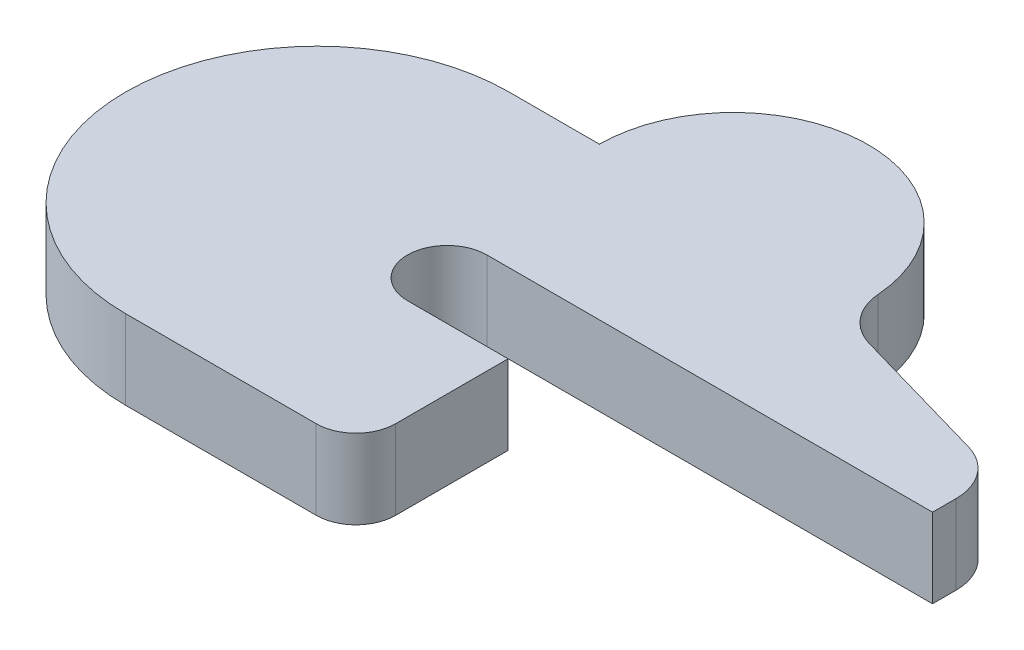
ISO-10303-21;
HEADER;
FILE_DESCRIPTION(('STEP AP214'),'2;1');
FILE_NAME('part.step','',(''),(''),'','','');
FILE_SCHEMA(('AUTOMOTIVE_DESIGN { 1 0 10303 214 1 1 1 1 }'));
ENDSEC;
DATA;
#1=APPLICATION_CONTEXT('core data for automotive mechanical design processes');
#2=APPLICATION_PROTOCOL_DEFINITION('international standard','automotive_design',2000,#1);
#3=PRODUCT_CONTEXT('',#1,'mechanical');
#4=PRODUCT('Part','Part','',(#3));
#5=PRODUCT_RELATED_PRODUCT_CATEGORY('part','',(#4));
#6=PRODUCT_DEFINITION_FORMATION('','',#4);
#7=PRODUCT_DEFINITION_CONTEXT('part definition',#1,'design');
#8=PRODUCT_DEFINITION('design','',#6,#7);
#9=PRODUCT_DEFINITION_SHAPE('','',#8);
#10=(LENGTH_UNIT() NAMED_UNIT(*) SI_UNIT(.MILLI.,.METRE.));
#11=(NAMED_UNIT(*) PLANE_ANGLE_UNIT() SI_UNIT($,.RADIAN.));
#12=(NAMED_UNIT(*) SI_UNIT($,.STERADIAN.) SOLID_ANGLE_UNIT());
#13=UNCERTAINTY_MEASURE_WITH_UNIT(LENGTH_MEASURE(1.E-05),#10,'distance_accuracy_value','');
#14=(GEOMETRIC_REPRESENTATION_CONTEXT(3) GLOBAL_UNCERTAINTY_ASSIGNED_CONTEXT((#13)) GLOBAL_UNIT_ASSIGNED_CONTEXT((#10,
#11,#12)) REPRESENTATION_CONTEXT('',''));
#15=CARTESIAN_POINT('',(0.,0.,0.));
#16=DIRECTION('',(0.,0.,1.));
#17=DIRECTION('',(1.,0.,0.));
#18=AXIS2_PLACEMENT_3D('',#15,#16,#17);
#19=CARTESIAN_POINT('',(0.,3.,4.25));
#20=DIRECTION('',(-1.,0.,0.));
#21=DIRECTION('',(0.,0.,1.));
#22=AXIS2_PLACEMENT_3D('',#19,#20,#21);
#23=PLANE('',#22);
#24=DIRECTION('',(0.,0.,-1.));
#25=VECTOR('',#24,1.);
#26=CARTESIAN_POINT('',(0.,0.,4.25));
#27=LINE('',#26,#25);
#28=CARTESIAN_POINT('',(0.,0.,4.25));
#29=VERTEX_POINT('',#28);
#30=CARTESIAN_POINT('',(0.,0.,0.));
#31=VERTEX_POINT('',#30);
#32=EDGE_CURVE('E165',#29,#31,#27,.T.);
#33=ORIENTED_EDGE('',*,*,#32,.T.);
#34=DIRECTION('',(0.,-1.,0.));
#35=VECTOR('',#34,1.);
#36=CARTESIAN_POINT('',(0.,3.,0.));
#37=LINE('',#36,#35);
#38=CARTESIAN_POINT('',(0.,3.,0.));
#39=VERTEX_POINT('',#38);
#40=EDGE_CURVE('E11',#39,#31,#37,.T.);
#41=ORIENTED_EDGE('',*,*,#40,.F.);
#42=DIRECTION('',(0.,0.,-1.));
#43=VECTOR('',#42,1.);
#44=CARTESIAN_POINT('',(0.,3.,4.25));
#45=LINE('',#44,#43);
#46=CARTESIAN_POINT('',(0.,3.,4.25));
#47=VERTEX_POINT('',#46);
#48=EDGE_CURVE('E191',#47,#39,#45,.T.);
#49=ORIENTED_EDGE('',*,*,#48,.F.);
#50=DIRECTION('',(0.,-1.,0.));
#51=VECTOR('',#50,1.);
#52=CARTESIAN_POINT('',(0.,3.,4.25));
#53=LINE('',#52,#51);
#54=EDGE_CURVE('E161',#47,#29,#53,.T.);
#55=ORIENTED_EDGE('',*,*,#54,.T.);
#56=EDGE_LOOP('',(#33,#41,#49,#55));
#57=FACE_BOUND('',#56,.T.);
#58=ADVANCED_FACE('F33',(#57),#23,.F.);
#59=CARTESIAN_POINT('',(0.,3.,0.));
#60=DIRECTION('',(0.,0.,1.));
#61=DIRECTION('',(1.,0.,0.));
#62=AXIS2_PLACEMENT_3D('',#59,#60,#61);
#63=PLANE('',#62);
#64=DIRECTION('',(-1.,0.,0.));
#65=VECTOR('',#64,1.);
#66=CARTESIAN_POINT('',(0.,0.,0.));
#67=LINE('',#66,#65);
#68=CARTESIAN_POINT('',(-3.8,0.,0.));
#69=VERTEX_POINT('',#68);
#70=EDGE_CURVE('E168',#31,#69,#67,.T.);
#71=ORIENTED_EDGE('',*,*,#70,.T.);
#72=DIRECTION('',(0.,-1.,0.));
#73=VECTOR('',#72,1.);
#74=CARTESIAN_POINT('',(-3.8,3.,0.));
#75=LINE('',#74,#73);
#76=CARTESIAN_POINT('',(-3.8,3.,0.));
#77=VERTEX_POINT('',#76);
#78=EDGE_CURVE('E41',#77,#69,#75,.T.);
#79=ORIENTED_EDGE('',*,*,#78,.F.);
#80=DIRECTION('',(-1.,0.,0.));
#81=VECTOR('',#80,1.);
#82=CARTESIAN_POINT('',(0.,3.,0.));
#83=LINE('',#82,#81);
#84=EDGE_CURVE('E110',#39,#77,#83,.T.);
#85=ORIENTED_EDGE('',*,*,#84,.F.);
#86=ORIENTED_EDGE('',*,*,#40,.T.);
#87=EDGE_LOOP('',(#71,#79,#85,#86));
#88=FACE_BOUND('',#87,.T.);
#89=ADVANCED_FACE('F279',(#88),#63,.F.);
#90=CARTESIAN_POINT('',(-3.8,3.,-1.5));
#91=DIRECTION('',(0.,-1.,0.));
#92=DIRECTION('',(0.,0.,-1.));
#93=AXIS2_PLACEMENT_3D('',#90,#91,#92);
#94=CYLINDRICAL_SURFACE('',#93,1.5);
#95=CARTESIAN_POINT('',(-3.8,0.,-1.5));
#96=DIRECTION('',(0.,-1.,0.));
#97=DIRECTION('',(0.,0.,-1.));
#98=AXIS2_PLACEMENT_3D('',#95,#96,#97);
#99=CIRCLE('',#98,1.5);
#100=CARTESIAN_POINT('',(-3.8,0.,-3.));
#101=VERTEX_POINT('',#100);
#102=EDGE_CURVE('E170',#69,#101,#99,.T.);
#103=ORIENTED_EDGE('',*,*,#102,.T.);
#104=DIRECTION('',(0.,-1.,0.));
#105=VECTOR('',#104,1.);
#106=CARTESIAN_POINT('',(-3.8,3.,-3.));
#107=LINE('',#106,#105);
#108=CARTESIAN_POINT('',(-3.8,3.,-3.));
#109=VERTEX_POINT('',#108);
#110=EDGE_CURVE('E216',#109,#101,#107,.T.);
#111=ORIENTED_EDGE('',*,*,#110,.F.);
#112=CARTESIAN_POINT('',(-3.8,3.,-1.5));
#113=DIRECTION('',(0.,-1.,0.));
#114=DIRECTION('',(0.,0.,-1.));
#115=AXIS2_PLACEMENT_3D('',#112,#113,#114);
#116=CIRCLE('',#115,1.5);
#117=EDGE_CURVE('E224',#77,#109,#116,.T.);
#118=ORIENTED_EDGE('',*,*,#117,.F.);
#119=ORIENTED_EDGE('',*,*,#78,.T.);
#120=EDGE_LOOP('',(#103,#111,#118,#119));
#121=FACE_BOUND('',#120,.T.);
#122=ADVANCED_FACE('F222',(#121),#94,.F.);
#123=CARTESIAN_POINT('',(-3.8,3.,-3.));
#124=DIRECTION('',(0.,0.,-1.));
#125=DIRECTION('',(-1.,0.,0.));
#126=AXIS2_PLACEMENT_3D('',#123,#124,#125);
#127=PLANE('',#126);
#128=DIRECTION('',(1.,0.,0.));
#129=VECTOR('',#128,1.);
#130=CARTESIAN_POINT('',(-3.8,0.,-3.));
#131=LINE('',#130,#129);
#132=CARTESIAN_POINT('',(13.04,0.,-3.));
#133=VERTEX_POINT('',#132);
#134=EDGE_CURVE('E172',#101,#133,#131,.T.);
#135=ORIENTED_EDGE('',*,*,#134,.T.);
#136=DIRECTION('',(0.,-1.,0.));
#137=VECTOR('',#136,1.);
#138=CARTESIAN_POINT('',(13.04,3.,-3.));
#139=LINE('',#138,#137);
#140=CARTESIAN_POINT('',(13.04,3.,-3.));
#141=VERTEX_POINT('',#140);
#142=EDGE_CURVE('E213',#141,#133,#139,.T.);
#143=ORIENTED_EDGE('',*,*,#142,.F.);
#144=DIRECTION('',(1.,0.,0.));
#145=VECTOR('',#144,1.);
#146=CARTESIAN_POINT('',(-3.8,3.,-3.));
#147=LINE('',#146,#145);
#148=EDGE_CURVE('E242',#109,#141,#147,.T.);
#149=ORIENTED_EDGE('',*,*,#148,.F.);
#150=ORIENTED_EDGE('',*,*,#110,.T.);
#151=EDGE_LOOP('',(#135,#143,#149,#150));
#152=FACE_BOUND('',#151,.T.);
#153=ADVANCED_FACE('F233',(#152),#127,.F.);
#154=CARTESIAN_POINT('',(13.04,3.,-3.));
#155=DIRECTION('',(-1.,0.,0.));
#156=DIRECTION('',(0.,0.,1.));
#157=AXIS2_PLACEMENT_3D('',#154,#155,#156);
#158=PLANE('',#157);
#159=DIRECTION('',(0.,0.,-1.));
#160=VECTOR('',#159,1.);
#161=CARTESIAN_POINT('',(13.04,0.,-3.));
#162=LINE('',#161,#160);
#163=CARTESIAN_POINT('',(13.04,0.,-3.89269180939431));
#164=VERTEX_POINT('',#163);
#165=EDGE_CURVE('E174',#133,#164,#162,.T.);
#166=ORIENTED_EDGE('',*,*,#165,.T.);
#167=DIRECTION('',(0.,-1.,0.));
#168=VECTOR('',#167,1.);
#169=CARTESIAN_POINT('',(13.04,3.,-3.89269180939431));
#170=LINE('',#169,#168);
#171=CARTESIAN_POINT('',(13.04,3.,-3.89269180939431));
#172=VERTEX_POINT('',#171);
#173=EDGE_CURVE('E210',#172,#164,#170,.T.);
#174=ORIENTED_EDGE('',*,*,#173,.F.);
#175=DIRECTION('',(0.,0.,-1.));
#176=VECTOR('',#175,1.);
#177=CARTESIAN_POINT('',(13.04,3.,-3.));
#178=LINE('',#177,#176);
#179=EDGE_CURVE('E239',#141,#172,#178,.T.);
#180=ORIENTED_EDGE('',*,*,#179,.F.);
#181=ORIENTED_EDGE('',*,*,#142,.T.);
#182=EDGE_LOOP('',(#166,#174,#180,#181));
#183=FACE_BOUND('',#182,.T.);
#184=ADVANCED_FACE('F237',(#183),#158,.F.);
#185=CARTESIAN_POINT('',(11.04,3.,-3.89269180939431));
#186=DIRECTION('',(0.,-1.,0.));
#187=DIRECTION('',(0.,0.,-1.));
#188=AXIS2_PLACEMENT_3D('',#185,#186,#187);
#189=CYLINDRICAL_SURFACE('',#188,2.);
#190=CARTESIAN_POINT('',(11.04,0.,-3.89269180939431));
#191=DIRECTION('',(0.,1.,0.));
#192=DIRECTION('',(0.,0.,1.));
#193=AXIS2_PLACEMENT_3D('',#190,#191,#192);
#194=CIRCLE('',#193,2.);
#195=CARTESIAN_POINT('',(11.591274711634,0.,-5.81521520127094));
#196=VERTEX_POINT('',#195);
#197=EDGE_CURVE('E176',#164,#196,#194,.T.);
#198=ORIENTED_EDGE('',*,*,#197,.T.);
#199=DIRECTION('',(0.,-1.,0.));
#200=VECTOR('',#199,1.);
#201=CARTESIAN_POINT('',(11.591274711634,3.,-5.81521520127094));
#202=LINE('',#201,#200);
#203=CARTESIAN_POINT('',(11.591274711634,3.,-5.81521520127094));
#204=VERTEX_POINT('',#203);
#205=EDGE_CURVE('E207',#204,#196,#202,.T.);
#206=ORIENTED_EDGE('',*,*,#205,.F.);
#207=CARTESIAN_POINT('',(11.04,3.,-3.89269180939431));
#208=DIRECTION('',(0.,1.,0.));
#209=DIRECTION('',(0.,0.,1.));
#210=AXIS2_PLACEMENT_3D('',#207,#208,#209);
#211=CIRCLE('',#210,2.);
#212=EDGE_CURVE('E241',#172,#204,#211,.T.);
#213=ORIENTED_EDGE('',*,*,#212,.F.);
#214=ORIENTED_EDGE('',*,*,#173,.T.);
#215=EDGE_LOOP('',(#198,#206,#213,#214));
#216=FACE_BOUND('',#215,.T.);
#217=ADVANCED_FACE('F292',(#216),#189,.T.);
#218=CARTESIAN_POINT('',(6.32867851532266,3.,-7.32424037767507));
#219=DIRECTION('',(-0.275637355817,0.,0.961261695938319));
#220=DIRECTION('',(0.961261695938319,0.,0.275637355817));
#221=AXIS2_PLACEMENT_3D('',#218,#219,#220);
#222=PLANE('',#221);
#223=DIRECTION('',(-0.961261695938319,0.,-0.275637355817));
#224=VECTOR('',#223,1.);
#225=CARTESIAN_POINT('',(6.32867851532266,0.,-7.32424037767507));
#226=LINE('',#225,#224);
#227=CARTESIAN_POINT('',(6.32867851532266,0.,-7.32424037767507));
#228=VERTEX_POINT('',#227);
#229=EDGE_CURVE('E178',#196,#228,#226,.T.);
#230=ORIENTED_EDGE('',*,*,#229,.T.);
#231=DIRECTION('',(0.,-1.,0.));
#232=VECTOR('',#231,1.);
#233=CARTESIAN_POINT('',(6.32867851532266,3.,-7.32424037767507));
#234=LINE('',#233,#232);
#235=CARTESIAN_POINT('',(6.32867851532266,3.,-7.32424037767507));
#236=VERTEX_POINT('',#235);
#237=EDGE_CURVE('E204',#236,#228,#234,.T.);
#238=ORIENTED_EDGE('',*,*,#237,.F.);
#239=DIRECTION('',(-0.961261695938319,0.,-0.275637355817));
#240=VECTOR('',#239,1.);
#241=CARTESIAN_POINT('',(6.32867851532266,3.,-7.32424037767507));
#242=LINE('',#241,#240);
#243=EDGE_CURVE('E244',#204,#236,#242,.T.);
#244=ORIENTED_EDGE('',*,*,#243,.F.);
#245=ORIENTED_EDGE('',*,*,#205,.T.);
#246=EDGE_LOOP('',(#230,#238,#244,#245));
#247=FACE_BOUND('',#246,.T.);
#248=ADVANCED_FACE('F295',(#247),#222,.F.);
#249=CARTESIAN_POINT('',(6.87995322695666,3.,-9.24676376955171));
#250=DIRECTION('',(0.,-1.,0.));
#251=DIRECTION('',(0.,0.,-1.));
#252=AXIS2_PLACEMENT_3D('',#249,#250,#251);
#253=CYLINDRICAL_SURFACE('',#252,2.);
#254=CARTESIAN_POINT('',(6.87995322695666,0.,-9.24676376955171));
#255=DIRECTION('',(0.,-1.,0.));
#256=DIRECTION('',(0.,0.,1.));
#257=AXIS2_PLACEMENT_3D('',#254,#255,#256);
#258=CIRCLE('',#257,2.);
#259=CARTESIAN_POINT('',(4.88560020527873,0.,-9.09657713591178));
#260=VERTEX_POINT('',#259);
#261=EDGE_CURVE('E180',#228,#260,#258,.T.);
#262=ORIENTED_EDGE('',*,*,#261,.T.);
#263=DIRECTION('',(0.,-1.,0.));
#264=VECTOR('',#263,1.);
#265=CARTESIAN_POINT('',(4.88560020527873,3.,-9.09657713591178));
#266=LINE('',#265,#264);
#267=CARTESIAN_POINT('',(4.88560020527873,3.,-9.09657713591178));
#268=VERTEX_POINT('',#267);
#269=EDGE_CURVE('E201',#268,#260,#266,.T.);
#270=ORIENTED_EDGE('',*,*,#269,.F.);
#271=CARTESIAN_POINT('',(6.87995322695666,3.,-9.24676376955171));
#272=DIRECTION('',(0.,-1.,0.));
#273=DIRECTION('',(0.,0.,1.));
#274=AXIS2_PLACEMENT_3D('',#271,#272,#273);
#275=CIRCLE('',#274,2.);
#276=EDGE_CURVE('E250',#236,#268,#275,.T.);
#277=ORIENTED_EDGE('',*,*,#276,.F.);
#278=ORIENTED_EDGE('',*,*,#237,.T.);
#279=EDGE_LOOP('',(#262,#270,#277,#278));
#280=FACE_BOUND('',#279,.T.);
#281=ADVANCED_FACE('F299',(#280),#253,.F.);
#282=CARTESIAN_POINT('',(-0.199999999999999,3.,-8.71360122012997));
#283=DIRECTION('',(0.,-1.,0.));
#284=DIRECTION('',(0.,0.,-1.));
#285=AXIS2_PLACEMENT_3D('',#282,#283,#284);
#286=CYLINDRICAL_SURFACE('',#285,5.1);
#287=CARTESIAN_POINT('',(-0.199999999999999,0.,-8.71360122012997));
#288=DIRECTION('',(0.,1.,0.));
#289=DIRECTION('',(0.,0.,-1.));
#290=AXIS2_PLACEMENT_3D('',#287,#288,#289);
#291=CIRCLE('',#290,5.1);
#292=CARTESIAN_POINT('',(-5.3,0.,-8.71360122012996));
#293=VERTEX_POINT('',#292);
#294=EDGE_CURVE('E182',#260,#293,#291,.T.);
#295=ORIENTED_EDGE('',*,*,#294,.T.);
#296=DIRECTION('',(0.,-1.,0.));
#297=VECTOR('',#296,1.);
#298=CARTESIAN_POINT('',(-5.3,3.,-8.71360122012996));
#299=LINE('',#298,#297);
#300=CARTESIAN_POINT('',(-5.3,3.,-8.71360122012996));
#301=VERTEX_POINT('',#300);
#302=EDGE_CURVE('E198',#301,#293,#299,.T.);
#303=ORIENTED_EDGE('',*,*,#302,.F.);
#304=CARTESIAN_POINT('',(-0.199999999999999,3.,-8.71360122012997));
#305=DIRECTION('',(0.,1.,0.));
#306=DIRECTION('',(0.,0.,-1.));
#307=AXIS2_PLACEMENT_3D('',#304,#305,#306);
#308=CIRCLE('',#307,5.1);
#309=EDGE_CURVE('E252',#268,#301,#308,.T.);
#310=ORIENTED_EDGE('',*,*,#309,.F.);
#311=ORIENTED_EDGE('',*,*,#269,.T.);
#312=EDGE_LOOP('',(#295,#303,#310,#311));
#313=FACE_BOUND('',#312,.T.);
#314=ADVANCED_FACE('F303',(#313),#286,.T.);
#315=CARTESIAN_POINT('',(-5.3,3.,-8.71360122012997));
#316=DIRECTION('',(-1.,0.,0.));
#317=DIRECTION('',(0.,0.,1.));
#318=AXIS2_PLACEMENT_3D('',#315,#316,#317);
#319=PLANE('',#318);
#320=DIRECTION('',(0.,0.,-1.));
#321=VECTOR('',#320,1.);
#322=CARTESIAN_POINT('',(-5.3,0.,-8.71360122012997));
#323=LINE('',#322,#321);
#324=CARTESIAN_POINT('',(-5.3,0.,-8.75));
#325=VERTEX_POINT('',#324);
#326=EDGE_CURVE('E184',#293,#325,#323,.T.);
#327=ORIENTED_EDGE('',*,*,#326,.T.);
#328=DIRECTION('',(0.,-1.,0.));
#329=VECTOR('',#328,1.);
#330=CARTESIAN_POINT('',(-5.3,3.,-8.75));
#331=LINE('',#330,#329);
#332=CARTESIAN_POINT('',(-5.3,3.,-8.75));
#333=VERTEX_POINT('',#332);
#334=EDGE_CURVE('E195',#333,#325,#331,.T.);
#335=ORIENTED_EDGE('',*,*,#334,.F.);
#336=DIRECTION('',(0.,0.,-1.));
#337=VECTOR('',#336,1.);
#338=CARTESIAN_POINT('',(-5.3,3.,-8.71360122012997));
#339=LINE('',#338,#337);
#340=EDGE_CURVE('E254',#301,#333,#339,.T.);
#341=ORIENTED_EDGE('',*,*,#340,.F.);
#342=ORIENTED_EDGE('',*,*,#302,.T.);
#343=EDGE_LOOP('',(#327,#335,#341,#342));
#344=FACE_BOUND('',#343,.T.);
#345=ADVANCED_FACE('F260',(#344),#319,.F.);
#346=CARTESIAN_POINT('',(-5.3,3.,-8.75));
#347=DIRECTION('',(0.,0.,1.));
#348=DIRECTION('',(1.,0.,0.));
#349=AXIS2_PLACEMENT_3D('',#346,#347,#348);
#350=PLANE('',#349);
#351=DIRECTION('',(-1.,0.,0.));
#352=VECTOR('',#351,1.);
#353=CARTESIAN_POINT('',(-5.3,0.,-8.75));
#354=LINE('',#353,#352);
#355=CARTESIAN_POINT('',(-8.71,0.,-8.75));
#356=VERTEX_POINT('',#355);
#357=EDGE_CURVE('E186',#325,#356,#354,.T.);
#358=ORIENTED_EDGE('',*,*,#357,.T.);
#359=DIRECTION('',(0.,-1.,0.));
#360=VECTOR('',#359,1.);
#361=CARTESIAN_POINT('',(-8.71,3.,-8.75));
#362=LINE('',#361,#360);
#363=CARTESIAN_POINT('',(-8.71,3.,-8.75));
#364=VERTEX_POINT('',#363);
#365=EDGE_CURVE('E156',#364,#356,#362,.T.);
#366=ORIENTED_EDGE('',*,*,#365,.F.);
#367=DIRECTION('',(-1.,0.,0.));
#368=VECTOR('',#367,1.);
#369=CARTESIAN_POINT('',(-5.3,3.,-8.75));
#370=LINE('',#369,#368);
#371=EDGE_CURVE('E147',#333,#364,#370,.T.);
#372=ORIENTED_EDGE('',*,*,#371,.F.);
#373=ORIENTED_EDGE('',*,*,#334,.T.);
#374=EDGE_LOOP('',(#358,#366,#372,#373));
#375=FACE_BOUND('',#374,.T.);
#376=ADVANCED_FACE('F264',(#375),#350,.F.);
#377=CARTESIAN_POINT('',(-8.71,3.,-1.5));
#378=DIRECTION('',(0.,-1.,0.));
#379=DIRECTION('',(0.,0.,-1.));
#380=AXIS2_PLACEMENT_3D('',#377,#378,#379);
#381=CYLINDRICAL_SURFACE('',#380,7.25);
#382=CARTESIAN_POINT('',(-8.71,0.,-1.5));
#383=DIRECTION('',(0.,1.,0.));
#384=DIRECTION('',(0.,0.,1.));
#385=AXIS2_PLACEMENT_3D('',#382,#383,#384);
#386=CIRCLE('',#385,7.25);
#387=CARTESIAN_POINT('',(-8.71,0.,5.75));
#388=VERTEX_POINT('',#387);
#389=EDGE_CURVE('E155',#356,#388,#386,.T.);
#390=ORIENTED_EDGE('',*,*,#389,.T.);
#391=DIRECTION('',(0.,-1.,0.));
#392=VECTOR('',#391,1.);
#393=CARTESIAN_POINT('',(-8.71,3.,5.75));
#394=LINE('',#393,#392);
#395=CARTESIAN_POINT('',(-8.71,3.,5.75));
#396=VERTEX_POINT('',#395);
#397=EDGE_CURVE('E152',#396,#388,#394,.T.);
#398=ORIENTED_EDGE('',*,*,#397,.F.);
#399=CARTESIAN_POINT('',(-8.71,3.,-1.5));
#400=DIRECTION('',(0.,1.,0.));
#401=DIRECTION('',(0.,0.,1.));
#402=AXIS2_PLACEMENT_3D('',#399,#400,#401);
#403=CIRCLE('',#402,7.25);
#404=EDGE_CURVE('E141',#364,#396,#403,.T.);
#405=ORIENTED_EDGE('',*,*,#404,.F.);
#406=ORIENTED_EDGE('',*,*,#365,.T.);
#407=EDGE_LOOP('',(#390,#398,#405,#406));
#408=FACE_BOUND('',#407,.T.);
#409=ADVANCED_FACE('F153',(#408),#381,.T.);
#410=CARTESIAN_POINT('',(-8.71,3.,5.75));
#411=DIRECTION('',(0.,0.,-1.));
#412=DIRECTION('',(-1.,0.,0.));
#413=AXIS2_PLACEMENT_3D('',#410,#411,#412);
#414=PLANE('',#413);
#415=DIRECTION('',(1.,0.,0.));
#416=VECTOR('',#415,1.);
#417=CARTESIAN_POINT('',(-8.71,0.,5.75));
#418=LINE('',#417,#416);
#419=CARTESIAN_POINT('',(-1.5,0.,5.75));
#420=VERTEX_POINT('',#419);
#421=EDGE_CURVE('E96',#388,#420,#418,.T.);
#422=ORIENTED_EDGE('',*,*,#421,.T.);
#423=DIRECTION('',(0.,-1.,0.));
#424=VECTOR('',#423,1.);
#425=CARTESIAN_POINT('',(-1.5,3.,5.75));
#426=LINE('',#425,#424);
#427=CARTESIAN_POINT('',(-1.5,3.,5.75));
#428=VERTEX_POINT('',#427);
#429=EDGE_CURVE('E157',#428,#420,#426,.T.);
#430=ORIENTED_EDGE('',*,*,#429,.F.);
#431=DIRECTION('',(1.,0.,0.));
#432=VECTOR('',#431,1.);
#433=CARTESIAN_POINT('',(-8.71,3.,5.75));
#434=LINE('',#433,#432);
#435=EDGE_CURVE('E145',#396,#428,#434,.T.);
#436=ORIENTED_EDGE('',*,*,#435,.F.);
#437=ORIENTED_EDGE('',*,*,#397,.T.);
#438=EDGE_LOOP('',(#422,#430,#436,#437));
#439=FACE_BOUND('',#438,.T.);
#440=ADVANCED_FACE('F159',(#439),#414,.F.);
#441=CARTESIAN_POINT('',(-1.5,3.,4.25));
#442=DIRECTION('',(0.,-1.,0.));
#443=DIRECTION('',(0.,0.,-1.));
#444=AXIS2_PLACEMENT_3D('',#441,#442,#443);
#445=CYLINDRICAL_SURFACE('',#444,1.5);
#446=CARTESIAN_POINT('',(-1.5,0.,4.25));
#447=DIRECTION('',(0.,1.,0.));
#448=DIRECTION('',(0.,0.,1.));
#449=AXIS2_PLACEMENT_3D('',#446,#447,#448);
#450=CIRCLE('',#449,1.5);
#451=EDGE_CURVE('E102',#420,#29,#450,.T.);
#452=ORIENTED_EDGE('',*,*,#451,.T.);
#453=ORIENTED_EDGE('',*,*,#54,.F.);
#454=CARTESIAN_POINT('',(-1.5,3.,4.25));
#455=DIRECTION('',(0.,1.,0.));
#456=DIRECTION('',(0.,0.,1.));
#457=AXIS2_PLACEMENT_3D('',#454,#455,#456);
#458=CIRCLE('',#457,1.5);
#459=EDGE_CURVE('E49',#428,#47,#458,.T.);
#460=ORIENTED_EDGE('',*,*,#459,.F.);
#461=ORIENTED_EDGE('',*,*,#429,.T.);
#462=EDGE_LOOP('',(#452,#453,#460,#461));
#463=FACE_BOUND('',#462,.T.);
#464=ADVANCED_FACE('F268',(#463),#445,.T.);
#465=CARTESIAN_POINT('',(-3.8,3.,-1.5));
#466=DIRECTION('',(0.,-1.,0.));
#467=DIRECTION('',(0.,0.,-1.));
#468=AXIS2_PLACEMENT_3D('',#465,#466,#467);
#469=PLANE('',#468);
#470=ORIENTED_EDGE('',*,*,#48,.T.);
#471=ORIENTED_EDGE('',*,*,#84,.T.);
#472=ORIENTED_EDGE('',*,*,#117,.T.);
#473=ORIENTED_EDGE('',*,*,#148,.T.);
#474=ORIENTED_EDGE('',*,*,#179,.T.);
#475=ORIENTED_EDGE('',*,*,#212,.T.);
#476=ORIENTED_EDGE('',*,*,#243,.T.);
#477=ORIENTED_EDGE('',*,*,#276,.T.);
#478=ORIENTED_EDGE('',*,*,#309,.T.);
#479=ORIENTED_EDGE('',*,*,#340,.T.);
#480=ORIENTED_EDGE('',*,*,#371,.T.);
#481=ORIENTED_EDGE('',*,*,#404,.T.);
#482=ORIENTED_EDGE('',*,*,#435,.T.);
#483=ORIENTED_EDGE('',*,*,#459,.T.);
#484=EDGE_LOOP('',(#470,#471,#472,#473,#474,#475,#476,#477,#478,#479,#480,#481,#482,#483));
#485=FACE_BOUND('',#484,.T.);
#486=ADVANCED_FACE('F143',(#485),#469,.F.);
#487=CARTESIAN_POINT('',(-3.8,0.,-1.5));
#488=DIRECTION('',(0.,-1.,0.));
#489=DIRECTION('',(0.,0.,-1.));
#490=AXIS2_PLACEMENT_3D('',#487,#488,#489);
#491=PLANE('',#490);
#492=ORIENTED_EDGE('',*,*,#32,.F.);
#493=ORIENTED_EDGE('',*,*,#451,.F.);
#494=ORIENTED_EDGE('',*,*,#421,.F.);
#495=ORIENTED_EDGE('',*,*,#389,.F.);
#496=ORIENTED_EDGE('',*,*,#357,.F.);
#497=ORIENTED_EDGE('',*,*,#326,.F.);
#498=ORIENTED_EDGE('',*,*,#294,.F.);
#499=ORIENTED_EDGE('',*,*,#261,.F.);
#500=ORIENTED_EDGE('',*,*,#229,.F.);
#501=ORIENTED_EDGE('',*,*,#197,.F.);
#502=ORIENTED_EDGE('',*,*,#165,.F.);
#503=ORIENTED_EDGE('',*,*,#134,.F.);
#504=ORIENTED_EDGE('',*,*,#102,.F.);
#505=ORIENTED_EDGE('',*,*,#70,.F.);
#506=EDGE_LOOP('',(#492,#493,#494,#495,#496,#497,#498,#499,#500,#501,#502,#503,#504,#505));
#507=FACE_BOUND('',#506,.T.);
#508=ADVANCED_FACE('F228',(#507),#491,.T.);
#509=CLOSED_SHELL('',(#58,#89,#122,#153,#184,#217,#248,#281,#314,#345,#376,#409,#440,#464,#486,#508));
#510=MANIFOLD_SOLID_BREP('B2',#509);
#511=ADVANCED_BREP_SHAPE_REPRESENTATION('',(#18,#510),#14);
#512=SHAPE_DEFINITION_REPRESENTATION(#9,#511);
ENDSEC;
END-ISO-10303-21;
